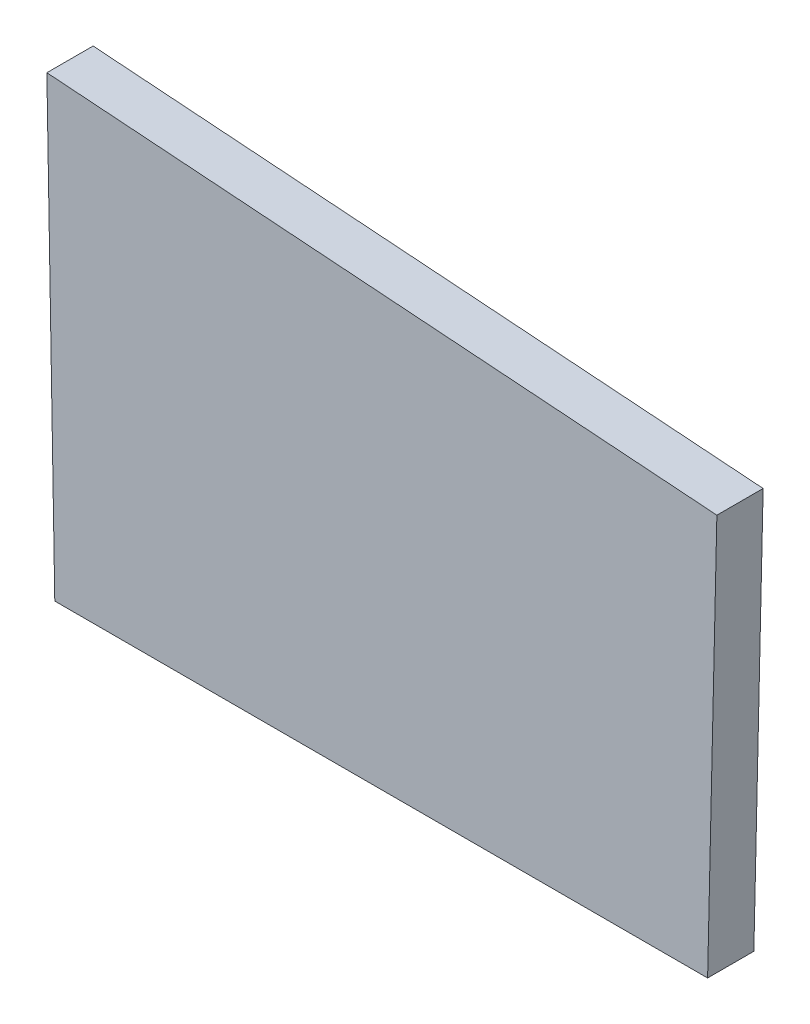
ISO-10303-21;
HEADER;
FILE_DESCRIPTION(('STEP AP214'),'2;1');
FILE_NAME('part.step','',(''),(''),'','','');
FILE_SCHEMA(('AUTOMOTIVE_DESIGN { 1 0 10303 214 1 1 1 1 }'));
ENDSEC;
DATA;
#1=APPLICATION_CONTEXT('core data for automotive mechanical design processes');
#2=APPLICATION_PROTOCOL_DEFINITION('international standard','automotive_design',2000,#1);
#3=PRODUCT_CONTEXT('',#1,'mechanical');
#4=PRODUCT('Part','Part','',(#3));
#5=PRODUCT_RELATED_PRODUCT_CATEGORY('part','',(#4));
#6=PRODUCT_DEFINITION_FORMATION('','',#4);
#7=PRODUCT_DEFINITION_CONTEXT('part definition',#1,'design');
#8=PRODUCT_DEFINITION('design','',#6,#7);
#9=PRODUCT_DEFINITION_SHAPE('','',#8);
#10=(LENGTH_UNIT() NAMED_UNIT(*) SI_UNIT(.MILLI.,.METRE.));
#11=(NAMED_UNIT(*) PLANE_ANGLE_UNIT() SI_UNIT($,.RADIAN.));
#12=(NAMED_UNIT(*) SI_UNIT($,.STERADIAN.) SOLID_ANGLE_UNIT());
#13=UNCERTAINTY_MEASURE_WITH_UNIT(LENGTH_MEASURE(1.E-05),#10,'distance_accuracy_value','');
#14=(GEOMETRIC_REPRESENTATION_CONTEXT(3) GLOBAL_UNCERTAINTY_ASSIGNED_CONTEXT((#13)) GLOBAL_UNIT_ASSIGNED_CONTEXT((#10,
#11,#12)) REPRESENTATION_CONTEXT('',''));
#15=CARTESIAN_POINT('',(0.,0.,0.));
#16=DIRECTION('',(0.,0.,1.));
#17=DIRECTION('',(1.,0.,0.));
#18=AXIS2_PLACEMENT_3D('',#15,#16,#17);
#19=CARTESIAN_POINT('',(28.23,0.,2.));
#20=DIRECTION('',(0.,1.,0.));
#21=DIRECTION('',(-1.,0.,0.));
#22=AXIS2_PLACEMENT_3D('',#19,#20,#21);
#23=PLANE('',#22);
#24=DIRECTION('',(1.,0.,0.));
#25=VECTOR('',#24,1.);
#26=CARTESIAN_POINT('',(28.23,0.,0.));
#27=LINE('',#26,#25);
#28=CARTESIAN_POINT('',(0.,0.,0.));
#29=VERTEX_POINT('',#28);
#30=CARTESIAN_POINT('',(28.23,0.,0.));
#31=VERTEX_POINT('',#30);
#32=EDGE_CURVE('E98',#29,#31,#27,.T.);
#33=ORIENTED_EDGE('',*,*,#32,.T.);
#34=DIRECTION('',(0.,0.,-1.));
#35=VECTOR('',#34,1.);
#36=CARTESIAN_POINT('',(28.23,0.,2.));
#37=LINE('',#36,#35);
#38=CARTESIAN_POINT('',(28.23,0.,2.));
#39=VERTEX_POINT('',#38);
#40=EDGE_CURVE('E11',#39,#31,#37,.T.);
#41=ORIENTED_EDGE('',*,*,#40,.F.);
#42=DIRECTION('',(1.,0.,0.));
#43=VECTOR('',#42,1.);
#44=CARTESIAN_POINT('',(28.23,0.,2.));
#45=LINE('',#44,#43);
#46=CARTESIAN_POINT('',(0.,0.,2.));
#47=VERTEX_POINT('',#46);
#48=EDGE_CURVE('E86',#47,#39,#45,.T.);
#49=ORIENTED_EDGE('',*,*,#48,.F.);
#50=DIRECTION('',(0.,0.,-1.));
#51=VECTOR('',#50,1.);
#52=CARTESIAN_POINT('',(0.,0.,2.));
#53=LINE('',#52,#51);
#54=EDGE_CURVE('E94',#47,#29,#53,.T.);
#55=ORIENTED_EDGE('',*,*,#54,.T.);
#56=EDGE_LOOP('',(#33,#41,#49,#55));
#57=FACE_BOUND('',#56,.T.);
#58=ADVANCED_FACE('F35',(#57),#23,.F.);
#59=CARTESIAN_POINT('',(28.6309506207036,17.5334161702663,2.));
#60=DIRECTION('',(-0.999738634409074,0.0228618212283957,0.));
#61=DIRECTION('',(-0.0228618212283957,-0.999738634409074,0.));
#62=AXIS2_PLACEMENT_3D('',#59,#60,#61);
#63=PLANE('',#62);
#64=DIRECTION('',(0.0228618212283957,0.999738634409074,0.));
#65=VECTOR('',#64,1.);
#66=CARTESIAN_POINT('',(28.6309506207036,17.5334161702663,0.));
#67=LINE('',#66,#65);
#68=CARTESIAN_POINT('',(28.6309506207036,17.5334161702663,0.));
#69=VERTEX_POINT('',#68);
#70=EDGE_CURVE('E90',#31,#69,#67,.T.);
#71=ORIENTED_EDGE('',*,*,#70,.T.);
#72=DIRECTION('',(0.,0.,-1.));
#73=VECTOR('',#72,1.);
#74=CARTESIAN_POINT('',(28.6309506207036,17.5334161702663,2.));
#75=LINE('',#74,#73);
#76=CARTESIAN_POINT('',(28.6309506207036,17.5334161702663,2.));
#77=VERTEX_POINT('',#76);
#78=EDGE_CURVE('E43',#77,#69,#75,.T.);
#79=ORIENTED_EDGE('',*,*,#78,.F.);
#80=DIRECTION('',(0.0228618212283957,0.999738634409074,0.));
#81=VECTOR('',#80,1.);
#82=CARTESIAN_POINT('',(28.6309506207036,17.5334161702663,2.));
#83=LINE('',#82,#81);
#84=EDGE_CURVE('E81',#39,#77,#83,.T.);
#85=ORIENTED_EDGE('',*,*,#84,.F.);
#86=ORIENTED_EDGE('',*,*,#40,.T.);
#87=EDGE_LOOP('',(#71,#79,#85,#86));
#88=FACE_BOUND('',#87,.T.);
#89=ADVANCED_FACE('F89',(#88),#63,.F.);
#90=CARTESIAN_POINT('',(-0.342416214299437,19.6170117789684,2.));
#91=DIRECTION('',(-0.0717289301413909,-0.997424162821801,0.));
#92=DIRECTION('',(0.997424162821802,-0.0717289301413909,0.));
#93=AXIS2_PLACEMENT_3D('',#90,#91,#92);
#94=PLANE('',#93);
#95=DIRECTION('',(-0.997424162821802,0.0717289301413909,0.));
#96=VECTOR('',#95,1.);
#97=CARTESIAN_POINT('',(-0.342416214299437,19.6170117789684,0.));
#98=LINE('',#97,#96);
#99=CARTESIAN_POINT('',(-0.342416214299437,19.6170117789684,0.));
#100=VERTEX_POINT('',#99);
#101=EDGE_CURVE('E68',#69,#100,#98,.T.);
#102=ORIENTED_EDGE('',*,*,#101,.T.);
#103=DIRECTION('',(0.,0.,-1.));
#104=VECTOR('',#103,1.);
#105=CARTESIAN_POINT('',(-0.342416214299437,19.6170117789684,2.));
#106=LINE('',#105,#104);
#107=CARTESIAN_POINT('',(-0.342416214299437,19.6170117789684,2.));
#108=VERTEX_POINT('',#107);
#109=EDGE_CURVE('E91',#108,#100,#106,.T.);
#110=ORIENTED_EDGE('',*,*,#109,.F.);
#111=DIRECTION('',(-0.997424162821802,0.0717289301413909,0.));
#112=VECTOR('',#111,1.);
#113=CARTESIAN_POINT('',(-0.342416214299437,19.6170117789684,2.));
#114=LINE('',#113,#112);
#115=EDGE_CURVE('E84',#77,#108,#114,.T.);
#116=ORIENTED_EDGE('',*,*,#115,.F.);
#117=ORIENTED_EDGE('',*,*,#78,.T.);
#118=EDGE_LOOP('',(#102,#110,#116,#117));
#119=FACE_BOUND('',#118,.T.);
#120=ADVANCED_FACE('F92',(#119),#94,.F.);
#121=CARTESIAN_POINT('',(0.,0.,2.));
#122=DIRECTION('',(0.999847695156391,0.0174524064372802,0.));
#123=DIRECTION('',(-0.0174524064372802,0.999847695156391,0.));
#124=AXIS2_PLACEMENT_3D('',#121,#122,#123);
#125=PLANE('',#124);
#126=DIRECTION('',(0.0174524064372802,-0.999847695156391,0.));
#127=VECTOR('',#126,1.);
#128=CARTESIAN_POINT('',(0.,0.,0.));
#129=LINE('',#128,#127);
#130=EDGE_CURVE('E74',#100,#29,#129,.T.);
#131=ORIENTED_EDGE('',*,*,#130,.T.);
#132=ORIENTED_EDGE('',*,*,#54,.F.);
#133=DIRECTION('',(0.0174524064372802,-0.999847695156391,0.));
#134=VECTOR('',#133,1.);
#135=CARTESIAN_POINT('',(0.,0.,2.));
#136=LINE('',#135,#134);
#137=EDGE_CURVE('E51',#108,#47,#136,.T.);
#138=ORIENTED_EDGE('',*,*,#137,.F.);
#139=ORIENTED_EDGE('',*,*,#109,.T.);
#140=EDGE_LOOP('',(#131,#132,#138,#139));
#141=FACE_BOUND('',#140,.T.);
#142=ADVANCED_FACE('F105',(#141),#125,.F.);
#143=CARTESIAN_POINT('',(0.,0.,2.));
#144=DIRECTION('',(0.,0.,-1.));
#145=DIRECTION('',(-1.,0.,0.));
#146=AXIS2_PLACEMENT_3D('',#143,#144,#145);
#147=PLANE('',#146);
#148=ORIENTED_EDGE('',*,*,#48,.T.);
#149=ORIENTED_EDGE('',*,*,#84,.T.);
#150=ORIENTED_EDGE('',*,*,#115,.T.);
#151=ORIENTED_EDGE('',*,*,#137,.T.);
#152=EDGE_LOOP('',(#148,#149,#150,#151));
#153=FACE_BOUND('',#152,.T.);
#154=ADVANCED_FACE('F82',(#153),#147,.F.);
#155=CARTESIAN_POINT('',(0.,0.,0.));
#156=DIRECTION('',(0.,0.,-1.));
#157=DIRECTION('',(-1.,0.,0.));
#158=AXIS2_PLACEMENT_3D('',#155,#156,#157);
#159=PLANE('',#158);
#160=ORIENTED_EDGE('',*,*,#32,.F.);
#161=ORIENTED_EDGE('',*,*,#130,.F.);
#162=ORIENTED_EDGE('',*,*,#101,.F.);
#163=ORIENTED_EDGE('',*,*,#70,.F.);
#164=EDGE_LOOP('',(#160,#161,#162,#163));
#165=FACE_BOUND('',#164,.T.);
#166=ADVANCED_FACE('F108',(#165),#159,.T.);
#167=CLOSED_SHELL('',(#58,#89,#120,#142,#154,#166));
#168=MANIFOLD_SOLID_BREP('B2',#167);
#169=ADVANCED_BREP_SHAPE_REPRESENTATION('',(#18,#168),#14);
#170=SHAPE_DEFINITION_REPRESENTATION(#9,#169);
ENDSEC;
END-ISO-10303-21;
